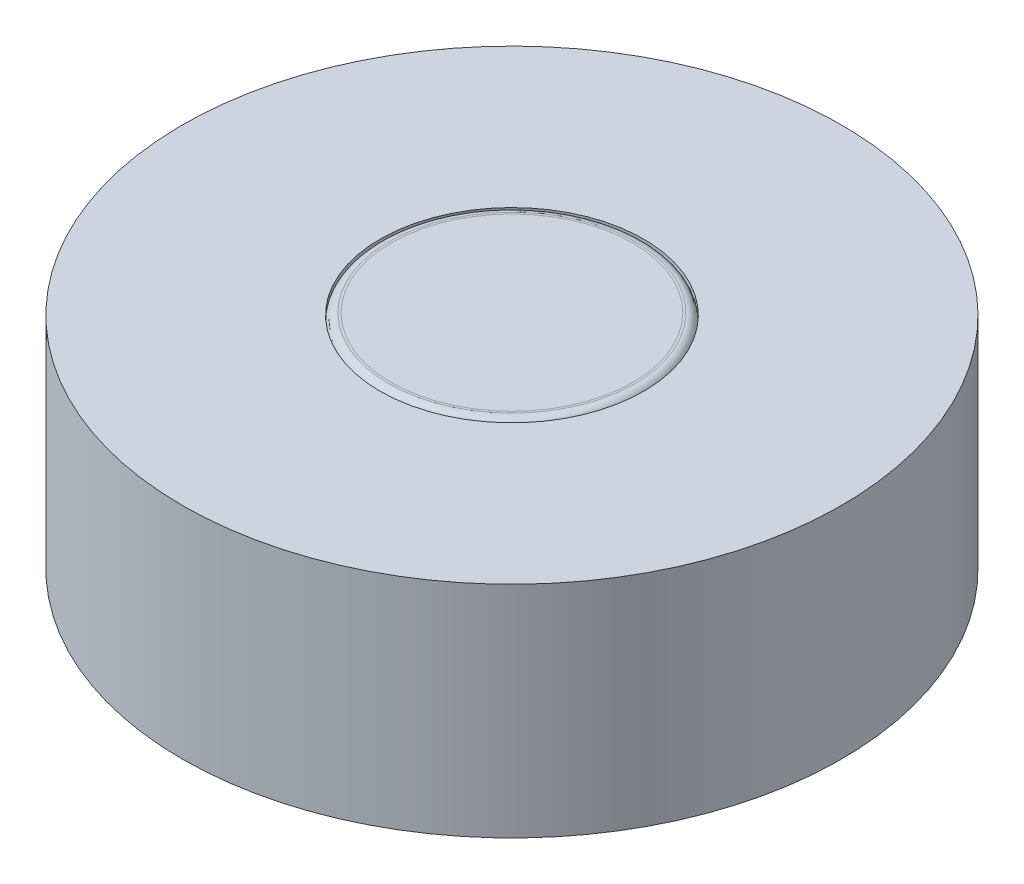
ISO-10303-21;
HEADER;
FILE_DESCRIPTION(('STEP AP214'),'2;1');
FILE_NAME('part.step','',(''),(''),'','','');
FILE_SCHEMA(('AUTOMOTIVE_DESIGN { 1 0 10303 214 1 1 1 1 }'));
ENDSEC;
DATA;
#1=APPLICATION_CONTEXT('core data for automotive mechanical design processes');
#2=APPLICATION_PROTOCOL_DEFINITION('international standard','automotive_design',2000,#1);
#3=PRODUCT_CONTEXT('',#1,'mechanical');
#4=PRODUCT('Part','Part','',(#3));
#5=PRODUCT_RELATED_PRODUCT_CATEGORY('part','',(#4));
#6=PRODUCT_DEFINITION_FORMATION('','',#4);
#7=PRODUCT_DEFINITION_CONTEXT('part definition',#1,'design');
#8=PRODUCT_DEFINITION('design','',#6,#7);
#9=PRODUCT_DEFINITION_SHAPE('','',#8);
#10=(LENGTH_UNIT() NAMED_UNIT(*) SI_UNIT(.MILLI.,.METRE.));
#11=(NAMED_UNIT(*) PLANE_ANGLE_UNIT() SI_UNIT($,.RADIAN.));
#12=(NAMED_UNIT(*) SI_UNIT($,.STERADIAN.) SOLID_ANGLE_UNIT());
#13=UNCERTAINTY_MEASURE_WITH_UNIT(LENGTH_MEASURE(1.E-05),#10,'distance_accuracy_value','');
#14=(GEOMETRIC_REPRESENTATION_CONTEXT(3) GLOBAL_UNCERTAINTY_ASSIGNED_CONTEXT((#13)) GLOBAL_UNIT_ASSIGNED_CONTEXT((#10,
#11,#12)) REPRESENTATION_CONTEXT('',''));
#15=CARTESIAN_POINT('',(0.,0.,0.));
#16=DIRECTION('',(0.,0.,1.));
#17=DIRECTION('',(1.,0.,0.));
#18=AXIS2_PLACEMENT_3D('',#15,#16,#17);
#19=CARTESIAN_POINT('',(0.,10.1,0.));
#20=DIRECTION('',(0.,-1.,0.));
#21=DIRECTION('',(0.,0.,-1.));
#22=AXIS2_PLACEMENT_3D('',#19,#20,#21);
#23=CYLINDRICAL_SURFACE('',#22,5.5);
#24=CARTESIAN_POINT('',(0.,10.1,0.));
#25=DIRECTION('',(0.,1.,0.));
#26=DIRECTION('',(0.,0.,1.));
#27=AXIS2_PLACEMENT_3D('',#24,#25,#26);
#28=CIRCLE('',#27,5.5);
#29=CARTESIAN_POINT('',(0.,10.1,5.5));
#30=VERTEX_POINT('',#29);
#31=EDGE_CURVE('E11',#30,#30,#28,.T.);
#32=ORIENTED_EDGE('',*,*,#31,.F.);
#33=EDGE_LOOP('',(#32));
#34=FACE_BOUND('',#33,.T.);
#35=CARTESIAN_POINT('',(0.,10.,0.));
#36=DIRECTION('',(0.,1.,0.));
#37=DIRECTION('',(0.,0.,1.));
#38=AXIS2_PLACEMENT_3D('',#35,#36,#37);
#39=CIRCLE('',#38,5.5);
#40=CARTESIAN_POINT('',(0.,10.,5.5));
#41=VERTEX_POINT('',#40);
#42=EDGE_CURVE('E45',#41,#41,#39,.T.);
#43=ORIENTED_EDGE('',*,*,#42,.T.);
#44=EDGE_LOOP('',(#43));
#45=FACE_BOUND('',#44,.T.);
#46=ADVANCED_FACE('F42',(#34,#45),#23,.T.);
#47=CARTESIAN_POINT('',(0.,10.1,0.));
#48=DIRECTION('',(0.,1.,0.));
#49=DIRECTION('',(0.,0.,1.));
#50=AXIS2_PLACEMENT_3D('',#47,#48,#49);
#51=PLANE('',#50);
#52=ORIENTED_EDGE('',*,*,#31,.T.);
#53=EDGE_LOOP('',(#52));
#54=FACE_BOUND('',#53,.T.);
#55=ADVANCED_FACE('F57',(#54),#51,.T.);
#56=CARTESIAN_POINT('',(0.,10.,0.));
#57=DIRECTION('',(0.,1.,0.));
#58=DIRECTION('',(0.,0.,1.));
#59=AXIS2_PLACEMENT_3D('',#56,#57,#58);
#60=PLANE('',#59);
#61=ORIENTED_EDGE('',*,*,#42,.F.);
#62=EDGE_LOOP('',(#61));
#63=FACE_BOUND('',#62,.T.);
#64=ADVANCED_FACE('F55',(#63),#60,.F.);
#65=CLOSED_SHELL('',(#46,#55,#64));
#66=MANIFOLD_SOLID_BREP('B2',#65);
#67=CARTESIAN_POINT('',(0.,10.1,0.));
#68=DIRECTION('',(0.,1.,0.));
#69=DIRECTION('',(0.,0.,1.));
#70=AXIS2_PLACEMENT_3D('',#67,#68,#69);
#71=PLANE('',#70);
#72=CARTESIAN_POINT('',(0.,10.1,0.));
#73=DIRECTION('',(0.,1.,0.));
#74=DIRECTION('',(0.,0.,1.));
#75=AXIS2_PLACEMENT_3D('',#72,#73,#74);
#76=CIRCLE('',#75,5.6);
#77=CARTESIAN_POINT('',(0.,10.1,5.6));
#78=VERTEX_POINT('',#77);
#79=EDGE_CURVE('E99',#78,#78,#76,.T.);
#80=ORIENTED_EDGE('',*,*,#79,.T.);
#81=EDGE_LOOP('',(#80));
#82=FACE_BOUND('',#81,.T.);
#83=CARTESIAN_POINT('',(0.,10.1,0.));
#84=DIRECTION('',(0.,1.,0.));
#85=DIRECTION('',(0.,0.,1.));
#86=AXIS2_PLACEMENT_3D('',#83,#84,#85);
#87=CIRCLE('',#86,5.5);
#88=CARTESIAN_POINT('',(0.,10.1,5.5));
#89=VERTEX_POINT('',#88);
#90=EDGE_CURVE('E107',#89,#89,#87,.T.);
#91=ORIENTED_EDGE('',*,*,#90,.F.);
#92=EDGE_LOOP('',(#91));
#93=FACE_BOUND('',#92,.T.);
#94=ADVANCED_FACE('F92',(#82,#93),#71,.T.);
#95=CARTESIAN_POINT('',(0.,0.,0.));
#96=DIRECTION('',(0.,1.,0.));
#97=DIRECTION('',(0.,0.,1.));
#98=AXIS2_PLACEMENT_3D('',#95,#96,#97);
#99=PLANE('',#98);
#100=CARTESIAN_POINT('',(0.,0.,0.));
#101=DIRECTION('',(0.,1.,0.));
#102=DIRECTION('',(0.,0.,1.));
#103=AXIS2_PLACEMENT_3D('',#100,#101,#102);
#104=CIRCLE('',#103,6.);
#105=CARTESIAN_POINT('',(0.,0.,6.));
#106=VERTEX_POINT('',#105);
#107=EDGE_CURVE('E103',#106,#106,#104,.T.);
#108=ORIENTED_EDGE('',*,*,#107,.F.);
#109=EDGE_LOOP('',(#108));
#110=FACE_BOUND('',#109,.T.);
#111=CARTESIAN_POINT('',(0.,0.,0.));
#112=DIRECTION('',(0.,1.,0.));
#113=DIRECTION('',(0.,0.,1.));
#114=AXIS2_PLACEMENT_3D('',#111,#112,#113);
#115=CIRCLE('',#114,5.5);
#116=CARTESIAN_POINT('',(0.,0.,5.5));
#117=VERTEX_POINT('',#116);
#118=EDGE_CURVE('E110',#117,#117,#115,.T.);
#119=ORIENTED_EDGE('',*,*,#118,.T.);
#120=EDGE_LOOP('',(#119));
#121=FACE_BOUND('',#120,.T.);
#122=ADVANCED_FACE('F120',(#110,#121),#99,.F.);
#123=CARTESIAN_POINT('',(0.,10.1,0.));
#124=DIRECTION('',(0.,-1.,0.));
#125=DIRECTION('',(0.,0.,-1.));
#126=AXIS2_PLACEMENT_3D('',#123,#124,#125);
#127=CYLINDRICAL_SURFACE('',#126,6.);
#128=CARTESIAN_POINT('',(0.,9.7,0.));
#129=DIRECTION('',(0.,1.,0.));
#130=DIRECTION('',(0.,0.,1.));
#131=AXIS2_PLACEMENT_3D('',#128,#129,#130);
#132=CIRCLE('',#131,6.);
#133=CARTESIAN_POINT('',(0.,9.7,6.));
#134=VERTEX_POINT('',#133);
#135=EDGE_CURVE('E41',#134,#134,#132,.F.);
#136=ORIENTED_EDGE('',*,*,#135,.T.);
#137=EDGE_LOOP('',(#136));
#138=FACE_BOUND('',#137,.T.);
#139=ORIENTED_EDGE('',*,*,#107,.T.);
#140=EDGE_LOOP('',(#139));
#141=FACE_BOUND('',#140,.T.);
#142=ADVANCED_FACE('F125',(#138,#141),#127,.T.);
#143=CARTESIAN_POINT('',(0.,10.1,0.));
#144=DIRECTION('',(0.,-1.,0.));
#145=DIRECTION('',(0.,0.,-1.));
#146=AXIS2_PLACEMENT_3D('',#143,#144,#145);
#147=CYLINDRICAL_SURFACE('',#146,5.5);
#148=ORIENTED_EDGE('',*,*,#90,.T.);
#149=EDGE_LOOP('',(#148));
#150=FACE_BOUND('',#149,.T.);
#151=ORIENTED_EDGE('',*,*,#118,.F.);
#152=EDGE_LOOP('',(#151));
#153=FACE_BOUND('',#152,.T.);
#154=ADVANCED_FACE('F116',(#150,#153),#147,.F.);
#155=CARTESIAN_POINT('',(0.,9.7,0.));
#156=DIRECTION('',(0.,1.,0.));
#157=DIRECTION('',(0.,0.,1.));
#158=AXIS2_PLACEMENT_3D('',#155,#156,#157);
#159=TOROIDAL_SURFACE('',#158,5.6,0.4);
#160=ORIENTED_EDGE('',*,*,#135,.F.);
#161=EDGE_LOOP('',(#160));
#162=FACE_BOUND('',#161,.T.);
#163=ORIENTED_EDGE('',*,*,#79,.F.);
#164=EDGE_LOOP('',(#163));
#165=FACE_BOUND('',#164,.T.);
#166=ADVANCED_FACE('F94',(#162,#165),#159,.T.);
#167=CLOSED_SHELL('',(#94,#122,#142,#154,#166));
#168=MANIFOLD_SOLID_BREP('B6',#167);
#169=CARTESIAN_POINT('',(0.,10.,0.));
#170=DIRECTION('',(0.,1.,0.));
#171=DIRECTION('',(0.,0.,1.));
#172=AXIS2_PLACEMENT_3D('',#169,#170,#171);
#173=PLANE('',#172);
#174=CARTESIAN_POINT('',(0.,10.,0.));
#175=DIRECTION('',(0.,1.,0.));
#176=DIRECTION('',(0.,0.,1.));
#177=AXIS2_PLACEMENT_3D('',#174,#175,#176);
#178=CIRCLE('',#177,15.);
#179=CARTESIAN_POINT('',(0.,10.,15.));
#180=VERTEX_POINT('',#179);
#181=EDGE_CURVE('E91',#180,#180,#178,.T.);
#182=ORIENTED_EDGE('',*,*,#181,.T.);
#183=EDGE_LOOP('',(#182));
#184=FACE_BOUND('',#183,.T.);
#185=CARTESIAN_POINT('',(0.,10.,0.));
#186=DIRECTION('',(0.,1.,0.));
#187=DIRECTION('',(0.,0.,1.));
#188=AXIS2_PLACEMENT_3D('',#185,#186,#187);
#189=CIRCLE('',#188,6.);
#190=CARTESIAN_POINT('',(0.,10.,6.));
#191=VERTEX_POINT('',#190);
#192=EDGE_CURVE('E180',#191,#191,#189,.T.);
#193=ORIENTED_EDGE('',*,*,#192,.F.);
#194=EDGE_LOOP('',(#193));
#195=FACE_BOUND('',#194,.T.);
#196=ADVANCED_FACE('F169',(#184,#195),#173,.T.);
#197=CARTESIAN_POINT('',(0.,0.,0.));
#198=DIRECTION('',(0.,1.,0.));
#199=DIRECTION('',(0.,0.,1.));
#200=AXIS2_PLACEMENT_3D('',#197,#198,#199);
#201=PLANE('',#200);
#202=CARTESIAN_POINT('',(0.,0.,0.));
#203=DIRECTION('',(0.,1.,0.));
#204=DIRECTION('',(0.,0.,1.));
#205=AXIS2_PLACEMENT_3D('',#202,#203,#204);
#206=CIRCLE('',#205,15.);
#207=CARTESIAN_POINT('',(0.,0.,15.));
#208=VERTEX_POINT('',#207);
#209=EDGE_CURVE('E173',#208,#208,#206,.T.);
#210=ORIENTED_EDGE('',*,*,#209,.F.);
#211=EDGE_LOOP('',(#210));
#212=FACE_BOUND('',#211,.T.);
#213=CARTESIAN_POINT('',(0.,0.,0.));
#214=DIRECTION('',(0.,1.,0.));
#215=DIRECTION('',(0.,0.,1.));
#216=AXIS2_PLACEMENT_3D('',#213,#214,#215);
#217=CIRCLE('',#216,6.);
#218=CARTESIAN_POINT('',(0.,0.,6.));
#219=VERTEX_POINT('',#218);
#220=EDGE_CURVE('E182',#219,#219,#217,.T.);
#221=ORIENTED_EDGE('',*,*,#220,.T.);
#222=EDGE_LOOP('',(#221));
#223=FACE_BOUND('',#222,.T.);
#224=ADVANCED_FACE('F192',(#212,#223),#201,.F.);
#225=CARTESIAN_POINT('',(0.,10.,0.));
#226=DIRECTION('',(0.,-1.,0.));
#227=DIRECTION('',(0.,0.,-1.));
#228=AXIS2_PLACEMENT_3D('',#225,#226,#227);
#229=CYLINDRICAL_SURFACE('',#228,15.);
#230=ORIENTED_EDGE('',*,*,#181,.F.);
#231=EDGE_LOOP('',(#230));
#232=FACE_BOUND('',#231,.T.);
#233=ORIENTED_EDGE('',*,*,#209,.T.);
#234=EDGE_LOOP('',(#233));
#235=FACE_BOUND('',#234,.T.);
#236=ADVANCED_FACE('F171',(#232,#235),#229,.T.);
#237=CARTESIAN_POINT('',(0.,10.,0.));
#238=DIRECTION('',(0.,-1.,0.));
#239=DIRECTION('',(0.,0.,-1.));
#240=AXIS2_PLACEMENT_3D('',#237,#238,#239);
#241=CYLINDRICAL_SURFACE('',#240,6.);
#242=ORIENTED_EDGE('',*,*,#192,.T.);
#243=EDGE_LOOP('',(#242));
#244=FACE_BOUND('',#243,.T.);
#245=ORIENTED_EDGE('',*,*,#220,.F.);
#246=EDGE_LOOP('',(#245));
#247=FACE_BOUND('',#246,.T.);
#248=ADVANCED_FACE('F188',(#244,#247),#241,.F.);
#249=CLOSED_SHELL('',(#196,#224,#236,#248));
#250=MANIFOLD_SOLID_BREP('B36',#249);
#251=ADVANCED_BREP_SHAPE_REPRESENTATION('',(#18,#66,#168,#250),#14);
#252=SHAPE_DEFINITION_REPRESENTATION(#9,#251);
ENDSEC;
END-ISO-10303-21;
